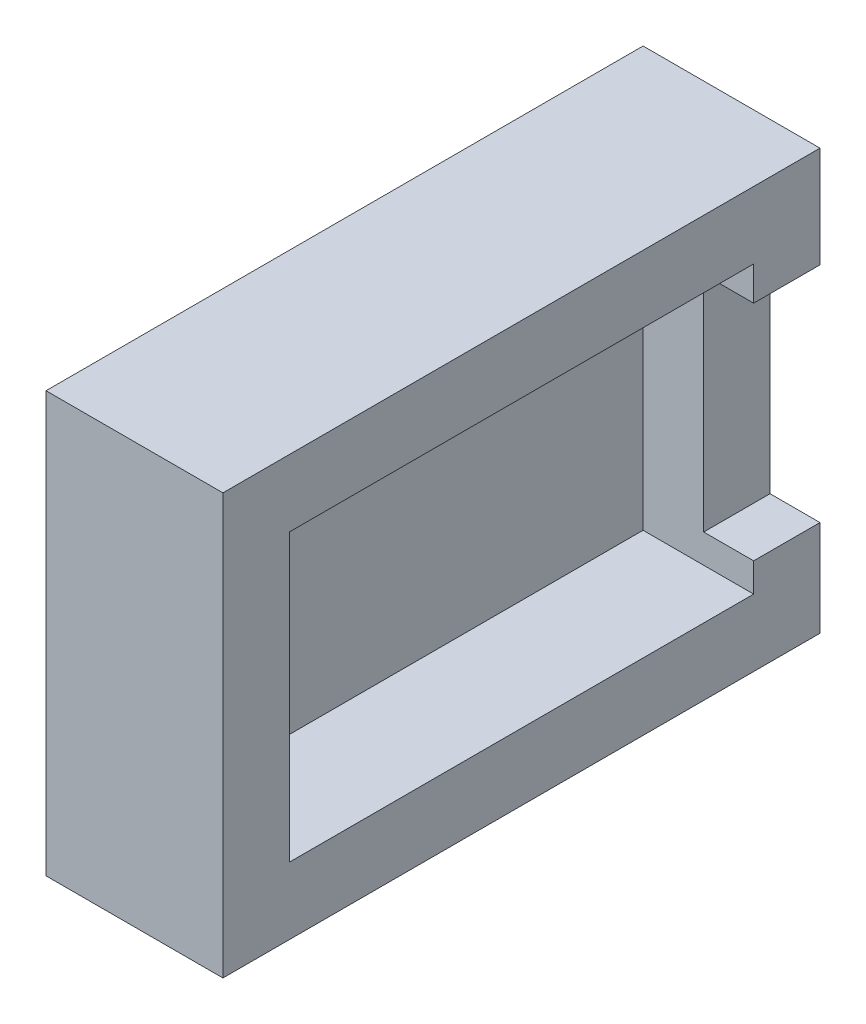
ISO-10303-21;
HEADER;
FILE_DESCRIPTION(('STEP AP214'),'2;1');
FILE_NAME('part.step','',(''),(''),'','','');
FILE_SCHEMA(('AUTOMOTIVE_DESIGN { 1 0 10303 214 1 1 1 1 }'));
ENDSEC;
DATA;
#1=APPLICATION_CONTEXT('core data for automotive mechanical design processes');
#2=APPLICATION_PROTOCOL_DEFINITION('international standard','automotive_design',2000,#1);
#3=PRODUCT_CONTEXT('',#1,'mechanical');
#4=PRODUCT('Part','Part','',(#3));
#5=PRODUCT_RELATED_PRODUCT_CATEGORY('part','',(#4));
#6=PRODUCT_DEFINITION_FORMATION('','',#4);
#7=PRODUCT_DEFINITION_CONTEXT('part definition',#1,'design');
#8=PRODUCT_DEFINITION('design','',#6,#7);
#9=PRODUCT_DEFINITION_SHAPE('','',#8);
#10=(LENGTH_UNIT() NAMED_UNIT(*) SI_UNIT(.MILLI.,.METRE.));
#11=(NAMED_UNIT(*) PLANE_ANGLE_UNIT() SI_UNIT($,.RADIAN.));
#12=(NAMED_UNIT(*) SI_UNIT($,.STERADIAN.) SOLID_ANGLE_UNIT());
#13=UNCERTAINTY_MEASURE_WITH_UNIT(LENGTH_MEASURE(1.E-05),#10,'distance_accuracy_value','');
#14=(GEOMETRIC_REPRESENTATION_CONTEXT(3) GLOBAL_UNCERTAINTY_ASSIGNED_CONTEXT((#13)) GLOBAL_UNIT_ASSIGNED_CONTEXT((#10,
#11,#12)) REPRESENTATION_CONTEXT('',''));
#15=CARTESIAN_POINT('',(0.,0.,0.));
#16=DIRECTION('',(0.,0.,1.));
#17=DIRECTION('',(1.,0.,0.));
#18=AXIS2_PLACEMENT_3D('',#15,#16,#17);
#19=CARTESIAN_POINT('',(3.,9.5,-13.5));
#20=DIRECTION('',(0.,0.,1.));
#21=DIRECTION('',(0.,-1.,0.));
#22=AXIS2_PLACEMENT_3D('',#19,#20,#21);
#23=PLANE('',#22);
#24=DIRECTION('',(0.,1.,0.));
#25=VECTOR('',#24,1.);
#26=CARTESIAN_POINT('',(8.,-9.5,-13.5));
#27=LINE('',#26,#25);
#28=CARTESIAN_POINT('',(8.,4.9285216682238,-13.5));
#29=VERTEX_POINT('',#28);
#30=CARTESIAN_POINT('',(8.,9.5,-13.5));
#31=VERTEX_POINT('',#30);
#32=EDGE_CURVE('E181',#29,#31,#27,.T.);
#33=ORIENTED_EDGE('',*,*,#32,.F.);
#34=DIRECTION('',(1.,0.,0.));
#35=VECTOR('',#34,1.);
#36=CARTESIAN_POINT('',(8.,4.9285216682238,-13.5));
#37=LINE('',#36,#35);
#38=CARTESIAN_POINT('',(5.74171811244555,4.9285216682238,-13.5));
#39=VERTEX_POINT('',#38);
#40=EDGE_CURVE('E129',#39,#29,#37,.T.);
#41=ORIENTED_EDGE('',*,*,#40,.F.);
#42=DIRECTION('',(0.,1.,0.));
#43=VECTOR('',#42,1.);
#44=CARTESIAN_POINT('',(5.74171811244555,4.9285216682238,-13.5));
#45=LINE('',#44,#43);
#46=CARTESIAN_POINT('',(5.74171811244555,-5.1627484405748,-13.5));
#47=VERTEX_POINT('',#46);
#48=EDGE_CURVE('E221',#47,#39,#45,.T.);
#49=ORIENTED_EDGE('',*,*,#48,.F.);
#50=DIRECTION('',(-1.,0.,0.));
#51=VECTOR('',#50,1.);
#52=CARTESIAN_POINT('',(8.,-5.1627484405748,-13.5));
#53=LINE('',#52,#51);
#54=CARTESIAN_POINT('',(8.,-5.1627484405748,-13.5));
#55=VERTEX_POINT('',#54);
#56=EDGE_CURVE('E218',#55,#47,#53,.T.);
#57=ORIENTED_EDGE('',*,*,#56,.F.);
#58=CARTESIAN_POINT('',(8.,-9.5,-13.5));
#59=VERTEX_POINT('',#58);
#60=EDGE_CURVE('E140',#59,#55,#27,.T.);
#61=ORIENTED_EDGE('',*,*,#60,.F.);
#62=DIRECTION('',(-1.,0.,0.));
#63=VECTOR('',#62,1.);
#64=CARTESIAN_POINT('',(3.,-9.5,-13.5));
#65=LINE('',#64,#63);
#66=CARTESIAN_POINT('',(0.,-9.5,-13.5));
#67=VERTEX_POINT('',#66);
#68=EDGE_CURVE('E195',#59,#67,#65,.T.);
#69=ORIENTED_EDGE('',*,*,#68,.T.);
#70=DIRECTION('',(0.,1.,0.));
#71=VECTOR('',#70,1.);
#72=CARTESIAN_POINT('',(0.,9.5,-13.5));
#73=LINE('',#72,#71);
#74=CARTESIAN_POINT('',(0.,9.5,-13.5));
#75=VERTEX_POINT('',#74);
#76=EDGE_CURVE('E186',#67,#75,#73,.T.);
#77=ORIENTED_EDGE('',*,*,#76,.T.);
#78=DIRECTION('',(-1.,0.,0.));
#79=VECTOR('',#78,1.);
#80=CARTESIAN_POINT('',(3.,9.5,-13.5));
#81=LINE('',#80,#79);
#82=EDGE_CURVE('E11',#31,#75,#81,.T.);
#83=ORIENTED_EDGE('',*,*,#82,.F.);
#84=EDGE_LOOP('',(#33,#41,#49,#57,#61,#69,#77,#83));
#85=FACE_BOUND('',#84,.T.);
#86=ADVANCED_FACE('F33',(#85),#23,.F.);
#87=CARTESIAN_POINT('',(3.,9.5,13.5));
#88=DIRECTION('',(0.,-1.,0.));
#89=DIRECTION('',(0.,0.,-1.));
#90=AXIS2_PLACEMENT_3D('',#87,#88,#89);
#91=PLANE('',#90);
#92=DIRECTION('',(0.,0.,1.));
#93=VECTOR('',#92,1.);
#94=CARTESIAN_POINT('',(0.,9.5,13.5));
#95=LINE('',#94,#93);
#96=CARTESIAN_POINT('',(0.,9.5,13.5));
#97=VERTEX_POINT('',#96);
#98=EDGE_CURVE('E189',#75,#97,#95,.T.);
#99=ORIENTED_EDGE('',*,*,#98,.T.);
#100=DIRECTION('',(-1.,0.,0.));
#101=VECTOR('',#100,1.);
#102=CARTESIAN_POINT('',(3.,9.5,13.5));
#103=LINE('',#102,#101);
#104=CARTESIAN_POINT('',(8.,9.5,13.5));
#105=VERTEX_POINT('',#104);
#106=EDGE_CURVE('E40',#105,#97,#103,.T.);
#107=ORIENTED_EDGE('',*,*,#106,.F.);
#108=DIRECTION('',(0.,0.,1.));
#109=VECTOR('',#108,1.);
#110=CARTESIAN_POINT('',(8.,9.5,-13.5));
#111=LINE('',#110,#109);
#112=EDGE_CURVE('E183',#31,#105,#111,.T.);
#113=ORIENTED_EDGE('',*,*,#112,.F.);
#114=ORIENTED_EDGE('',*,*,#82,.T.);
#115=EDGE_LOOP('',(#99,#107,#113,#114));
#116=FACE_BOUND('',#115,.T.);
#117=ADVANCED_FACE('F253',(#116),#91,.F.);
#118=CARTESIAN_POINT('',(3.,9.5,13.5));
#119=DIRECTION('',(0.,0.,-1.));
#120=DIRECTION('',(0.,1.,0.));
#121=AXIS2_PLACEMENT_3D('',#118,#119,#120);
#122=PLANE('',#121);
#123=DIRECTION('',(0.,-1.,0.));
#124=VECTOR('',#123,1.);
#125=CARTESIAN_POINT('',(0.,9.5,13.5));
#126=LINE('',#125,#124);
#127=CARTESIAN_POINT('',(0.,-9.5,13.5));
#128=VERTEX_POINT('',#127);
#129=EDGE_CURVE('E191',#97,#128,#126,.T.);
#130=ORIENTED_EDGE('',*,*,#129,.T.);
#131=DIRECTION('',(-1.,0.,0.));
#132=VECTOR('',#131,1.);
#133=CARTESIAN_POINT('',(3.,-9.5,13.5));
#134=LINE('',#133,#132);
#135=CARTESIAN_POINT('',(8.,-9.5,13.5));
#136=VERTEX_POINT('',#135);
#137=EDGE_CURVE('E198',#136,#128,#134,.T.);
#138=ORIENTED_EDGE('',*,*,#137,.F.);
#139=DIRECTION('',(0.,-1.,0.));
#140=VECTOR('',#139,1.);
#141=CARTESIAN_POINT('',(8.,-9.5,13.5));
#142=LINE('',#141,#140);
#143=EDGE_CURVE('E176',#105,#136,#142,.T.);
#144=ORIENTED_EDGE('',*,*,#143,.F.);
#145=ORIENTED_EDGE('',*,*,#106,.T.);
#146=EDGE_LOOP('',(#130,#138,#144,#145));
#147=FACE_BOUND('',#146,.T.);
#148=ADVANCED_FACE('F204',(#147),#122,.F.);
#149=CARTESIAN_POINT('',(3.,-9.5,13.5));
#150=DIRECTION('',(0.,1.,0.));
#151=DIRECTION('',(0.,0.,1.));
#152=AXIS2_PLACEMENT_3D('',#149,#150,#151);
#153=PLANE('',#152);
#154=DIRECTION('',(0.,0.,-1.));
#155=VECTOR('',#154,1.);
#156=CARTESIAN_POINT('',(0.,-9.5,13.5));
#157=LINE('',#156,#155);
#158=EDGE_CURVE('E193',#128,#67,#157,.T.);
#159=ORIENTED_EDGE('',*,*,#158,.T.);
#160=ORIENTED_EDGE('',*,*,#68,.F.);
#161=DIRECTION('',(0.,0.,-1.));
#162=VECTOR('',#161,1.);
#163=CARTESIAN_POINT('',(8.,-9.5,-13.5));
#164=LINE('',#163,#162);
#165=EDGE_CURVE('E179',#136,#59,#164,.T.);
#166=ORIENTED_EDGE('',*,*,#165,.F.);
#167=ORIENTED_EDGE('',*,*,#137,.T.);
#168=EDGE_LOOP('',(#159,#160,#166,#167));
#169=FACE_BOUND('',#168,.T.);
#170=ADVANCED_FACE('F212',(#169),#153,.F.);
#171=CARTESIAN_POINT('',(0.,0.,0.));
#172=DIRECTION('',(1.,0.,0.));
#173=DIRECTION('',(0.,0.,-1.));
#174=AXIS2_PLACEMENT_3D('',#171,#172,#173);
#175=PLANE('',#174);
#176=ORIENTED_EDGE('',*,*,#76,.F.);
#177=ORIENTED_EDGE('',*,*,#158,.F.);
#178=ORIENTED_EDGE('',*,*,#129,.F.);
#179=ORIENTED_EDGE('',*,*,#98,.F.);
#180=EDGE_LOOP('',(#176,#177,#178,#179));
#181=FACE_BOUND('',#180,.T.);
#182=ADVANCED_FACE('F210',(#181),#175,.F.);
#183=CARTESIAN_POINT('',(8.,0.,0.));
#184=DIRECTION('',(1.,0.,0.));
#185=DIRECTION('',(0.,0.,-1.));
#186=AXIS2_PLACEMENT_3D('',#183,#184,#185);
#187=PLANE('',#186);
#188=DIRECTION('',(0.,0.,-1.));
#189=VECTOR('',#188,1.);
#190=CARTESIAN_POINT('',(8.,4.9285216682238,-10.5));
#191=LINE('',#190,#189);
#192=CARTESIAN_POINT('',(8.,4.9285216682238,-10.5));
#193=VERTEX_POINT('',#192);
#194=EDGE_CURVE('E160',#193,#29,#191,.T.);
#195=ORIENTED_EDGE('',*,*,#194,.T.);
#196=ORIENTED_EDGE('',*,*,#32,.T.);
#197=ORIENTED_EDGE('',*,*,#112,.T.);
#198=ORIENTED_EDGE('',*,*,#143,.T.);
#199=ORIENTED_EDGE('',*,*,#165,.T.);
#200=ORIENTED_EDGE('',*,*,#60,.T.);
#201=DIRECTION('',(0.,0.,-1.));
#202=VECTOR('',#201,1.);
#203=CARTESIAN_POINT('',(8.,-5.1627484405748,-10.5));
#204=LINE('',#203,#202);
#205=CARTESIAN_POINT('',(8.,-5.1627484405748,-10.5));
#206=VERTEX_POINT('',#205);
#207=EDGE_CURVE('E124',#206,#55,#204,.T.);
#208=ORIENTED_EDGE('',*,*,#207,.F.);
#209=DIRECTION('',(0.,1.,0.));
#210=VECTOR('',#209,1.);
#211=CARTESIAN_POINT('',(8.,6.46592168432389,-10.5));
#212=LINE('',#211,#210);
#213=CARTESIAN_POINT('',(8.,-6.46592168432389,-10.5));
#214=VERTEX_POINT('',#213);
#215=EDGE_CURVE('E137',#214,#206,#212,.T.);
#216=ORIENTED_EDGE('',*,*,#215,.F.);
#217=DIRECTION('',(0.,0.,-1.));
#218=VECTOR('',#217,1.);
#219=CARTESIAN_POINT('',(8.,-6.46592168432389,-10.5));
#220=LINE('',#219,#218);
#221=CARTESIAN_POINT('',(8.,-6.46592168432389,10.5));
#222=VERTEX_POINT('',#221);
#223=EDGE_CURVE('E154',#222,#214,#220,.T.);
#224=ORIENTED_EDGE('',*,*,#223,.F.);
#225=DIRECTION('',(0.,-1.,0.));
#226=VECTOR('',#225,1.);
#227=CARTESIAN_POINT('',(8.,6.46592168432389,10.5));
#228=LINE('',#227,#226);
#229=CARTESIAN_POINT('',(8.,6.46592168432389,10.5));
#230=VERTEX_POINT('',#229);
#231=EDGE_CURVE('E166',#230,#222,#228,.T.);
#232=ORIENTED_EDGE('',*,*,#231,.F.);
#233=DIRECTION('',(0.,0.,1.));
#234=VECTOR('',#233,1.);
#235=CARTESIAN_POINT('',(8.,6.46592168432389,-10.5));
#236=LINE('',#235,#234);
#237=CARTESIAN_POINT('',(8.,6.46592168432389,-10.5));
#238=VERTEX_POINT('',#237);
#239=EDGE_CURVE('E149',#238,#230,#236,.T.);
#240=ORIENTED_EDGE('',*,*,#239,.F.);
#241=EDGE_CURVE('E150',#193,#238,#212,.T.);
#242=ORIENTED_EDGE('',*,*,#241,.F.);
#243=EDGE_LOOP('',(#195,#196,#197,#198,#199,#200,#208,#216,#224,#232,#240,#242));
#244=FACE_BOUND('',#243,.T.);
#245=ADVANCED_FACE('F135',(#244),#187,.T.);
#246=CARTESIAN_POINT('',(8.,6.46592168432389,10.5));
#247=DIRECTION('',(0.,0.,-1.));
#248=DIRECTION('',(0.,1.,0.));
#249=AXIS2_PLACEMENT_3D('',#246,#247,#248);
#250=PLANE('',#249);
#251=DIRECTION('',(0.,-1.,0.));
#252=VECTOR('',#251,1.);
#253=CARTESIAN_POINT('',(3.,6.46592168432389,10.5));
#254=LINE('',#253,#252);
#255=CARTESIAN_POINT('',(3.,6.46592168432389,10.5));
#256=VERTEX_POINT('',#255);
#257=CARTESIAN_POINT('',(3.,-6.46592168432389,10.5));
#258=VERTEX_POINT('',#257);
#259=EDGE_CURVE('E55',#256,#258,#254,.T.);
#260=ORIENTED_EDGE('',*,*,#259,.F.);
#261=DIRECTION('',(-1.,0.,0.));
#262=VECTOR('',#261,1.);
#263=CARTESIAN_POINT('',(8.,6.46592168432389,10.5));
#264=LINE('',#263,#262);
#265=EDGE_CURVE('E152',#230,#256,#264,.T.);
#266=ORIENTED_EDGE('',*,*,#265,.F.);
#267=ORIENTED_EDGE('',*,*,#231,.T.);
#268=DIRECTION('',(-1.,0.,0.));
#269=VECTOR('',#268,1.);
#270=CARTESIAN_POINT('',(8.,-6.46592168432389,10.5));
#271=LINE('',#270,#269);
#272=EDGE_CURVE('E173',#222,#258,#271,.T.);
#273=ORIENTED_EDGE('',*,*,#272,.T.);
#274=EDGE_LOOP('',(#260,#266,#267,#273));
#275=FACE_BOUND('',#274,.T.);
#276=ADVANCED_FACE('F243',(#275),#250,.T.);
#277=CARTESIAN_POINT('',(8.,-6.46592168432389,-10.5));
#278=DIRECTION('',(0.,1.,0.));
#279=DIRECTION('',(0.,0.,1.));
#280=AXIS2_PLACEMENT_3D('',#277,#278,#279);
#281=PLANE('',#280);
#282=DIRECTION('',(0.,0.,-1.));
#283=VECTOR('',#282,1.);
#284=CARTESIAN_POINT('',(3.,-6.46592168432389,-10.5));
#285=LINE('',#284,#283);
#286=CARTESIAN_POINT('',(3.,-6.46592168432389,-10.5));
#287=VERTEX_POINT('',#286);
#288=EDGE_CURVE('E159',#258,#287,#285,.T.);
#289=ORIENTED_EDGE('',*,*,#288,.F.);
#290=ORIENTED_EDGE('',*,*,#272,.F.);
#291=ORIENTED_EDGE('',*,*,#223,.T.);
#292=DIRECTION('',(-1.,0.,0.));
#293=VECTOR('',#292,1.);
#294=CARTESIAN_POINT('',(8.,-6.46592168432389,-10.5));
#295=LINE('',#294,#293);
#296=EDGE_CURVE('E148',#214,#287,#295,.T.);
#297=ORIENTED_EDGE('',*,*,#296,.T.);
#298=EDGE_LOOP('',(#289,#290,#291,#297));
#299=FACE_BOUND('',#298,.T.);
#300=ADVANCED_FACE('F236',(#299),#281,.T.);
#301=CARTESIAN_POINT('',(8.,6.46592168432389,-10.5));
#302=DIRECTION('',(0.,0.,1.));
#303=DIRECTION('',(1.,0.,0.));
#304=AXIS2_PLACEMENT_3D('',#301,#302,#303);
#305=PLANE('',#304);
#306=DIRECTION('',(1.,0.,0.));
#307=VECTOR('',#306,1.);
#308=CARTESIAN_POINT('',(8.,4.9285216682238,-10.5));
#309=LINE('',#308,#307);
#310=CARTESIAN_POINT('',(5.74171811244555,4.9285216682238,-10.5));
#311=VERTEX_POINT('',#310);
#312=EDGE_CURVE('E141',#311,#193,#309,.T.);
#313=ORIENTED_EDGE('',*,*,#312,.T.);
#314=ORIENTED_EDGE('',*,*,#241,.T.);
#315=DIRECTION('',(-1.,0.,0.));
#316=VECTOR('',#315,1.);
#317=CARTESIAN_POINT('',(8.,6.46592168432389,-10.5));
#318=LINE('',#317,#316);
#319=CARTESIAN_POINT('',(3.,6.46592168432389,-10.5));
#320=VERTEX_POINT('',#319);
#321=EDGE_CURVE('E169',#238,#320,#318,.T.);
#322=ORIENTED_EDGE('',*,*,#321,.T.);
#323=DIRECTION('',(0.,1.,0.));
#324=VECTOR('',#323,1.);
#325=CARTESIAN_POINT('',(3.,6.46592168432389,-10.5));
#326=LINE('',#325,#324);
#327=EDGE_CURVE('E162',#287,#320,#326,.T.);
#328=ORIENTED_EDGE('',*,*,#327,.F.);
#329=ORIENTED_EDGE('',*,*,#296,.F.);
#330=ORIENTED_EDGE('',*,*,#215,.T.);
#331=DIRECTION('',(-1.,0.,0.));
#332=VECTOR('',#331,1.);
#333=CARTESIAN_POINT('',(8.,-5.1627484405748,-10.5));
#334=LINE('',#333,#332);
#335=CARTESIAN_POINT('',(5.74171811244555,-5.1627484405748,-10.5));
#336=VERTEX_POINT('',#335);
#337=EDGE_CURVE('E120',#206,#336,#334,.T.);
#338=ORIENTED_EDGE('',*,*,#337,.T.);
#339=DIRECTION('',(0.,1.,0.));
#340=VECTOR('',#339,1.);
#341=CARTESIAN_POINT('',(5.74171811244555,4.9285216682238,-10.5));
#342=LINE('',#341,#340);
#343=EDGE_CURVE('E47',#336,#311,#342,.T.);
#344=ORIENTED_EDGE('',*,*,#343,.T.);
#345=EDGE_LOOP('',(#313,#314,#322,#328,#329,#330,#338,#344));
#346=FACE_BOUND('',#345,.T.);
#347=ADVANCED_FACE('F145',(#346),#305,.T.);
#348=CARTESIAN_POINT('',(8.,6.46592168432389,-10.5));
#349=DIRECTION('',(0.,-1.,0.));
#350=DIRECTION('',(0.,0.,-1.));
#351=AXIS2_PLACEMENT_3D('',#348,#349,#350);
#352=PLANE('',#351);
#353=DIRECTION('',(0.,0.,1.));
#354=VECTOR('',#353,1.);
#355=CARTESIAN_POINT('',(3.,6.46592168432389,-10.5));
#356=LINE('',#355,#354);
#357=EDGE_CURVE('E164',#320,#256,#356,.T.);
#358=ORIENTED_EDGE('',*,*,#357,.F.);
#359=ORIENTED_EDGE('',*,*,#321,.F.);
#360=ORIENTED_EDGE('',*,*,#239,.T.);
#361=ORIENTED_EDGE('',*,*,#265,.T.);
#362=EDGE_LOOP('',(#358,#359,#360,#361));
#363=FACE_BOUND('',#362,.T.);
#364=ADVANCED_FACE('F242',(#363),#352,.T.);
#365=CARTESIAN_POINT('',(3.,0.,0.));
#366=DIRECTION('',(1.,0.,0.));
#367=DIRECTION('',(0.,0.,-1.));
#368=AXIS2_PLACEMENT_3D('',#365,#366,#367);
#369=PLANE('',#368);
#370=ORIENTED_EDGE('',*,*,#259,.T.);
#371=ORIENTED_EDGE('',*,*,#288,.T.);
#372=ORIENTED_EDGE('',*,*,#327,.T.);
#373=ORIENTED_EDGE('',*,*,#357,.T.);
#374=EDGE_LOOP('',(#370,#371,#372,#373));
#375=FACE_BOUND('',#374,.T.);
#376=ADVANCED_FACE('F266',(#375),#369,.T.);
#377=CARTESIAN_POINT('',(8.,4.9285216682238,-10.5));
#378=DIRECTION('',(0.,1.,0.));
#379=DIRECTION('',(0.,0.,1.));
#380=AXIS2_PLACEMENT_3D('',#377,#378,#379);
#381=PLANE('',#380);
#382=ORIENTED_EDGE('',*,*,#40,.T.);
#383=ORIENTED_EDGE('',*,*,#194,.F.);
#384=ORIENTED_EDGE('',*,*,#312,.F.);
#385=DIRECTION('',(0.,0.,-1.));
#386=VECTOR('',#385,1.);
#387=CARTESIAN_POINT('',(5.74171811244555,4.9285216682238,-10.5));
#388=LINE('',#387,#386);
#389=EDGE_CURVE('E229',#311,#39,#388,.T.);
#390=ORIENTED_EDGE('',*,*,#389,.T.);
#391=EDGE_LOOP('',(#382,#383,#384,#390));
#392=FACE_BOUND('',#391,.T.);
#393=ADVANCED_FACE('F268',(#392),#381,.F.);
#394=CARTESIAN_POINT('',(5.74171811244555,4.9285216682238,-10.5));
#395=DIRECTION('',(-1.,0.,0.));
#396=DIRECTION('',(0.,0.,1.));
#397=AXIS2_PLACEMENT_3D('',#394,#395,#396);
#398=PLANE('',#397);
#399=ORIENTED_EDGE('',*,*,#48,.T.);
#400=ORIENTED_EDGE('',*,*,#389,.F.);
#401=ORIENTED_EDGE('',*,*,#343,.F.);
#402=DIRECTION('',(0.,0.,-1.));
#403=VECTOR('',#402,1.);
#404=CARTESIAN_POINT('',(5.74171811244555,-5.1627484405748,-10.5));
#405=LINE('',#404,#403);
#406=EDGE_CURVE('E126',#336,#47,#405,.T.);
#407=ORIENTED_EDGE('',*,*,#406,.T.);
#408=EDGE_LOOP('',(#399,#400,#401,#407));
#409=FACE_BOUND('',#408,.T.);
#410=ADVANCED_FACE('F273',(#409),#398,.F.);
#411=CARTESIAN_POINT('',(8.,-5.1627484405748,-10.5));
#412=DIRECTION('',(0.,-1.,0.));
#413=DIRECTION('',(0.,0.,-1.));
#414=AXIS2_PLACEMENT_3D('',#411,#412,#413);
#415=PLANE('',#414);
#416=ORIENTED_EDGE('',*,*,#56,.T.);
#417=ORIENTED_EDGE('',*,*,#406,.F.);
#418=ORIENTED_EDGE('',*,*,#337,.F.);
#419=ORIENTED_EDGE('',*,*,#207,.T.);
#420=EDGE_LOOP('',(#416,#417,#418,#419));
#421=FACE_BOUND('',#420,.T.);
#422=ADVANCED_FACE('F123',(#421),#415,.F.);
#423=CLOSED_SHELL('',(#86,#117,#148,#170,#182,#245,#276,#300,#347,#364,#376,#393,#410,#422));
#424=MANIFOLD_SOLID_BREP('B2',#423);
#425=ADVANCED_BREP_SHAPE_REPRESENTATION('',(#18,#424),#14);
#426=SHAPE_DEFINITION_REPRESENTATION(#9,#425);
ENDSEC;
END-ISO-10303-21;
